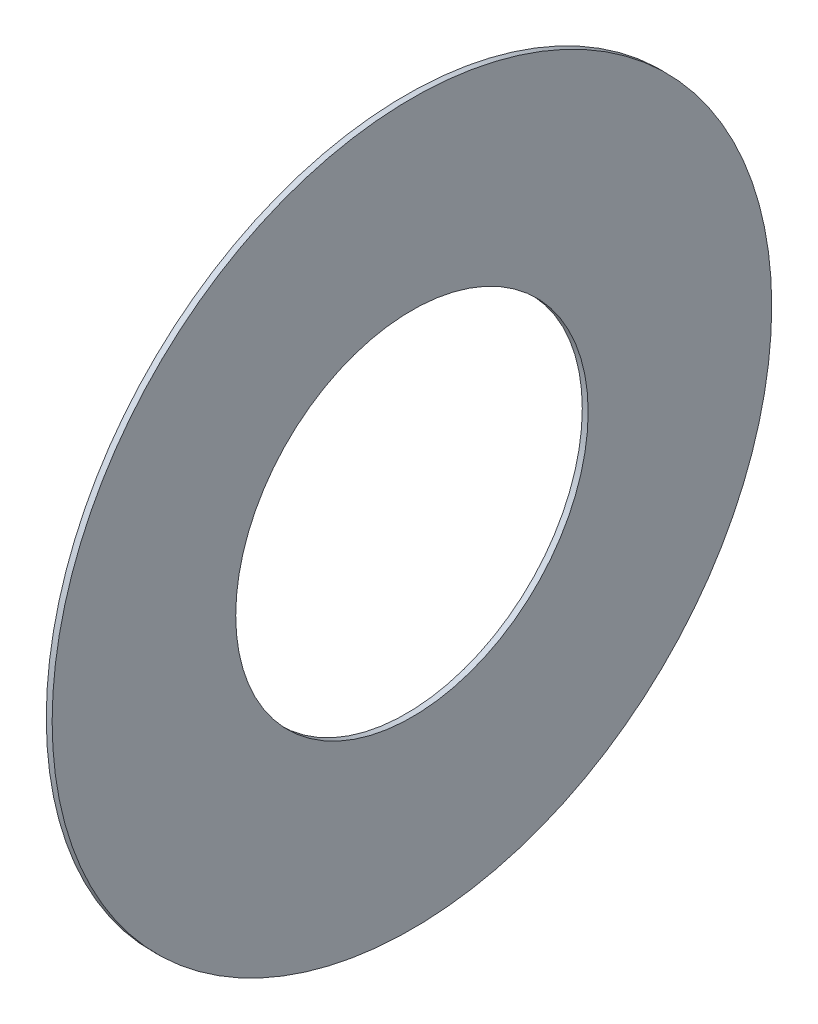
ISO-10303-21;
HEADER;
FILE_DESCRIPTION(('STEP AP214'),'2;1');
FILE_NAME('part.step','',(''),(''),'','','');
FILE_SCHEMA(('AUTOMOTIVE_DESIGN { 1 0 10303 214 1 1 1 1 }'));
ENDSEC;
DATA;
#1=APPLICATION_CONTEXT('core data for automotive mechanical design processes');
#2=APPLICATION_PROTOCOL_DEFINITION('international standard','automotive_design',2000,#1);
#3=PRODUCT_CONTEXT('',#1,'mechanical');
#4=PRODUCT('Part','Part','',(#3));
#5=PRODUCT_RELATED_PRODUCT_CATEGORY('part','',(#4));
#6=PRODUCT_DEFINITION_FORMATION('','',#4);
#7=PRODUCT_DEFINITION_CONTEXT('part definition',#1,'design');
#8=PRODUCT_DEFINITION('design','',#6,#7);
#9=PRODUCT_DEFINITION_SHAPE('','',#8);
#10=(LENGTH_UNIT() NAMED_UNIT(*) SI_UNIT(.MILLI.,.METRE.));
#11=(NAMED_UNIT(*) PLANE_ANGLE_UNIT() SI_UNIT($,.RADIAN.));
#12=(NAMED_UNIT(*) SI_UNIT($,.STERADIAN.) SOLID_ANGLE_UNIT());
#13=UNCERTAINTY_MEASURE_WITH_UNIT(LENGTH_MEASURE(1.E-05),#10,'distance_accuracy_value','');
#14=(GEOMETRIC_REPRESENTATION_CONTEXT(3) GLOBAL_UNCERTAINTY_ASSIGNED_CONTEXT((#13)) GLOBAL_UNIT_ASSIGNED_CONTEXT((#10,
#11,#12)) REPRESENTATION_CONTEXT('',''));
#15=CARTESIAN_POINT('',(0.,0.,0.));
#16=DIRECTION('',(0.,0.,1.));
#17=DIRECTION('',(1.,0.,0.));
#18=AXIS2_PLACEMENT_3D('',#15,#16,#17);
#19=CARTESIAN_POINT('',(0.,0.,0.));
#20=DIRECTION('',(1.,0.,0.));
#21=DIRECTION('',(0.,0.,-1.));
#22=AXIS2_PLACEMENT_3D('',#19,#20,#21);
#23=PLANE('',#22);
#24=CARTESIAN_POINT('',(0.,0.,0.));
#25=DIRECTION('',(1.,0.,0.));
#26=DIRECTION('',(0.,0.,-1.));
#27=AXIS2_PLACEMENT_3D('',#24,#25,#26);
#28=CIRCLE('',#27,12.25);
#29=CARTESIAN_POINT('',(0.,0.,-12.25));
#30=VERTEX_POINT('',#29);
#31=EDGE_CURVE('E27',#30,#30,#28,.F.);
#32=ORIENTED_EDGE('',*,*,#31,.F.);
#33=EDGE_LOOP('',(#32));
#34=FACE_BOUND('',#33,.T.);
#35=CARTESIAN_POINT('',(0.,0.,0.));
#36=DIRECTION('',(1.,0.,0.));
#37=DIRECTION('',(0.,0.,-1.));
#38=AXIS2_PLACEMENT_3D('',#35,#36,#37);
#39=CIRCLE('',#38,6.);
#40=CARTESIAN_POINT('',(0.,0.,-6.));
#41=VERTEX_POINT('',#40);
#42=EDGE_CURVE('E18',#41,#41,#39,.F.);
#43=ORIENTED_EDGE('',*,*,#42,.T.);
#44=EDGE_LOOP('',(#43));
#45=FACE_BOUND('',#44,.T.);
#46=ADVANCED_FACE('F15',(#34,#45),#23,.T.);
#47=CARTESIAN_POINT('',(-0.21,0.,0.));
#48=DIRECTION('',(1.,0.,0.));
#49=DIRECTION('',(0.,0.,-1.));
#50=AXIS2_PLACEMENT_3D('',#47,#48,#49);
#51=CYLINDRICAL_SURFACE('',#50,6.);
#52=ORIENTED_EDGE('',*,*,#42,.F.);
#53=EDGE_LOOP('',(#52));
#54=FACE_BOUND('',#53,.T.);
#55=CARTESIAN_POINT('',(-0.2,0.,0.));
#56=DIRECTION('',(1.,0.,0.));
#57=DIRECTION('',(0.,0.,-1.));
#58=AXIS2_PLACEMENT_3D('',#55,#56,#57);
#59=CIRCLE('',#58,6.);
#60=CARTESIAN_POINT('',(-0.2,0.,-6.));
#61=VERTEX_POINT('',#60);
#62=EDGE_CURVE('E22',#61,#61,#59,.F.);
#63=ORIENTED_EDGE('',*,*,#62,.T.);
#64=EDGE_LOOP('',(#63));
#65=FACE_BOUND('',#64,.T.);
#66=ADVANCED_FACE('F36',(#54,#65),#51,.F.);
#67=CARTESIAN_POINT('',(-0.21,0.,0.));
#68=DIRECTION('',(1.,0.,0.));
#69=DIRECTION('',(0.,0.,-1.));
#70=AXIS2_PLACEMENT_3D('',#67,#68,#69);
#71=CYLINDRICAL_SURFACE('',#70,12.25);
#72=ORIENTED_EDGE('',*,*,#31,.T.);
#73=EDGE_LOOP('',(#72));
#74=FACE_BOUND('',#73,.T.);
#75=CARTESIAN_POINT('',(-0.2,0.,0.));
#76=DIRECTION('',(1.,0.,0.));
#77=DIRECTION('',(0.,0.,-1.));
#78=AXIS2_PLACEMENT_3D('',#75,#76,#77);
#79=CIRCLE('',#78,12.25);
#80=CARTESIAN_POINT('',(-0.2,0.,-12.25));
#81=VERTEX_POINT('',#80);
#82=EDGE_CURVE('E10',#81,#81,#79,.T.);
#83=ORIENTED_EDGE('',*,*,#82,.T.);
#84=EDGE_LOOP('',(#83));
#85=FACE_BOUND('',#84,.T.);
#86=ADVANCED_FACE('F39',(#74,#85),#71,.T.);
#87=CARTESIAN_POINT('',(-0.2,0.,0.));
#88=DIRECTION('',(1.,0.,0.));
#89=DIRECTION('',(0.,0.,-1.));
#90=AXIS2_PLACEMENT_3D('',#87,#88,#89);
#91=PLANE('',#90);
#92=ORIENTED_EDGE('',*,*,#82,.F.);
#93=EDGE_LOOP('',(#92));
#94=FACE_BOUND('',#93,.T.);
#95=ORIENTED_EDGE('',*,*,#62,.F.);
#96=EDGE_LOOP('',(#95));
#97=FACE_BOUND('',#96,.T.);
#98=ADVANCED_FACE('F42',(#94,#97),#91,.F.);
#99=CLOSED_SHELL('',(#46,#66,#86,#98));
#100=MANIFOLD_SOLID_BREP('B1',#99);
#101=ADVANCED_BREP_SHAPE_REPRESENTATION('',(#18,#100),#14);
#102=SHAPE_DEFINITION_REPRESENTATION(#9,#101);
ENDSEC;
END-ISO-10303-21;
